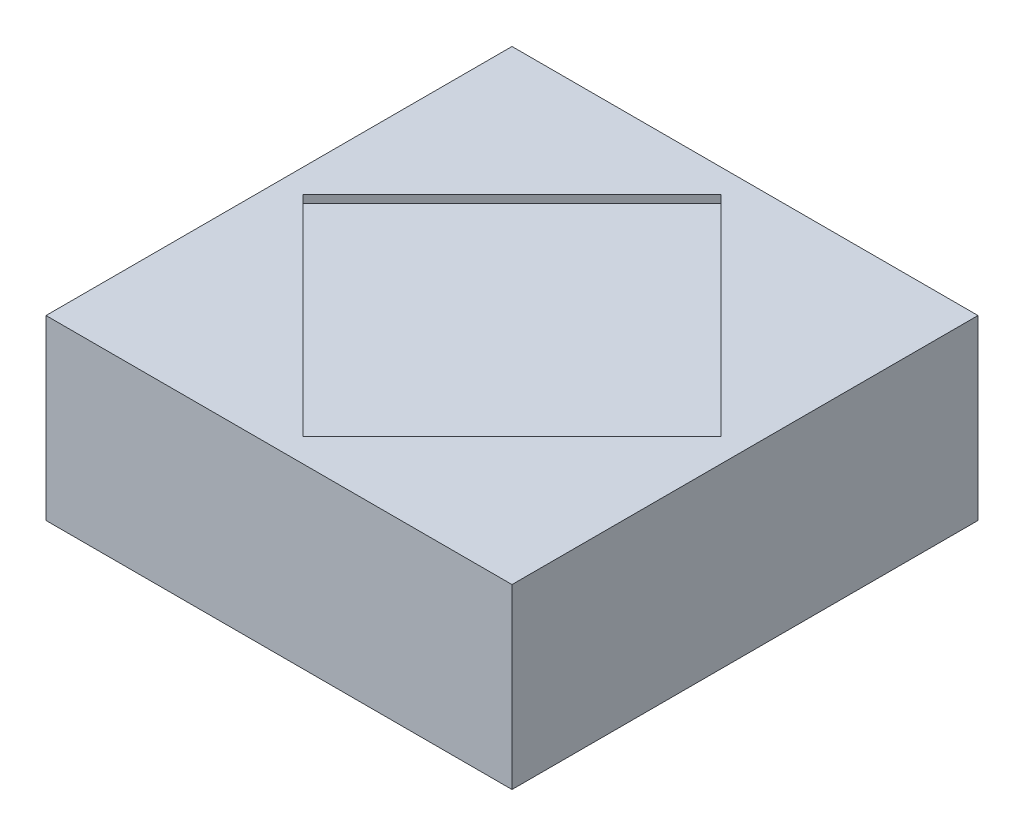
ISO-10303-21;
HEADER;
FILE_DESCRIPTION(('STEP AP214'),'2;1');
FILE_NAME('part.step','',(''),(''),'','','');
FILE_SCHEMA(('AUTOMOTIVE_DESIGN { 1 0 10303 214 1 1 1 1 }'));
ENDSEC;
DATA;
#1=APPLICATION_CONTEXT('core data for automotive mechanical design processes');
#2=APPLICATION_PROTOCOL_DEFINITION('international standard','automotive_design',2000,#1);
#3=PRODUCT_CONTEXT('',#1,'mechanical');
#4=PRODUCT('Part','Part','',(#3));
#5=PRODUCT_RELATED_PRODUCT_CATEGORY('part','',(#4));
#6=PRODUCT_DEFINITION_FORMATION('','',#4);
#7=PRODUCT_DEFINITION_CONTEXT('part definition',#1,'design');
#8=PRODUCT_DEFINITION('design','',#6,#7);
#9=PRODUCT_DEFINITION_SHAPE('','',#8);
#10=(LENGTH_UNIT() NAMED_UNIT(*) SI_UNIT(.MILLI.,.METRE.));
#11=(NAMED_UNIT(*) PLANE_ANGLE_UNIT() SI_UNIT($,.RADIAN.));
#12=(NAMED_UNIT(*) SI_UNIT($,.STERADIAN.) SOLID_ANGLE_UNIT());
#13=UNCERTAINTY_MEASURE_WITH_UNIT(LENGTH_MEASURE(1.E-05),#10,'distance_accuracy_value','');
#14=(GEOMETRIC_REPRESENTATION_CONTEXT(3) GLOBAL_UNCERTAINTY_ASSIGNED_CONTEXT((#13)) GLOBAL_UNIT_ASSIGNED_CONTEXT((#10,
#11,#12)) REPRESENTATION_CONTEXT('',''));
#15=CARTESIAN_POINT('',(0.,0.,0.));
#16=DIRECTION('',(0.,0.,1.));
#17=DIRECTION('',(1.,0.,0.));
#18=AXIS2_PLACEMENT_3D('',#15,#16,#17);
#19=CARTESIAN_POINT('',(0.,12.,0.));
#20=DIRECTION('',(1.,0.,0.));
#21=DIRECTION('',(0.,0.,-1.));
#22=AXIS2_PLACEMENT_3D('',#19,#20,#21);
#23=PLANE('',#22);
#24=DIRECTION('',(0.,0.,1.));
#25=VECTOR('',#24,1.);
#26=CARTESIAN_POINT('',(0.,0.,0.));
#27=LINE('',#26,#25);
#28=CARTESIAN_POINT('',(0.,0.,-31.5));
#29=VERTEX_POINT('',#28);
#30=CARTESIAN_POINT('',(0.,0.,0.));
#31=VERTEX_POINT('',#30);
#32=EDGE_CURVE('E143',#29,#31,#27,.T.);
#33=ORIENTED_EDGE('',*,*,#32,.T.);
#34=DIRECTION('',(0.,-1.,0.));
#35=VECTOR('',#34,1.);
#36=CARTESIAN_POINT('',(0.,12.,0.));
#37=LINE('',#36,#35);
#38=CARTESIAN_POINT('',(0.,12.,0.));
#39=VERTEX_POINT('',#38);
#40=EDGE_CURVE('E11',#39,#31,#37,.T.);
#41=ORIENTED_EDGE('',*,*,#40,.F.);
#42=DIRECTION('',(0.,0.,1.));
#43=VECTOR('',#42,1.);
#44=CARTESIAN_POINT('',(0.,12.,0.));
#45=LINE('',#44,#43);
#46=CARTESIAN_POINT('',(0.,12.,-31.5));
#47=VERTEX_POINT('',#46);
#48=EDGE_CURVE('E147',#47,#39,#45,.T.);
#49=ORIENTED_EDGE('',*,*,#48,.F.);
#50=DIRECTION('',(0.,-1.,0.));
#51=VECTOR('',#50,1.);
#52=CARTESIAN_POINT('',(0.,12.,-31.5));
#53=LINE('',#52,#51);
#54=EDGE_CURVE('E153',#47,#29,#53,.T.);
#55=ORIENTED_EDGE('',*,*,#54,.T.);
#56=EDGE_LOOP('',(#33,#41,#49,#55));
#57=FACE_BOUND('',#56,.T.);
#58=ADVANCED_FACE('F35',(#57),#23,.F.);
#59=CARTESIAN_POINT('',(0.,12.,0.));
#60=DIRECTION('',(0.,0.,-1.));
#61=DIRECTION('',(-1.,0.,0.));
#62=AXIS2_PLACEMENT_3D('',#59,#60,#61);
#63=PLANE('',#62);
#64=DIRECTION('',(1.,0.,0.));
#65=VECTOR('',#64,1.);
#66=CARTESIAN_POINT('',(0.,0.,0.));
#67=LINE('',#66,#65);
#68=CARTESIAN_POINT('',(31.5,0.,0.));
#69=VERTEX_POINT('',#68);
#70=EDGE_CURVE('E156',#31,#69,#67,.T.);
#71=ORIENTED_EDGE('',*,*,#70,.T.);
#72=DIRECTION('',(0.,-1.,0.));
#73=VECTOR('',#72,1.);
#74=CARTESIAN_POINT('',(31.5,12.,0.));
#75=LINE('',#74,#73);
#76=CARTESIAN_POINT('',(31.5,12.,0.));
#77=VERTEX_POINT('',#76);
#78=EDGE_CURVE('E42',#77,#69,#75,.T.);
#79=ORIENTED_EDGE('',*,*,#78,.F.);
#80=DIRECTION('',(1.,0.,0.));
#81=VECTOR('',#80,1.);
#82=CARTESIAN_POINT('',(0.,12.,0.));
#83=LINE('',#82,#81);
#84=EDGE_CURVE('E86',#39,#77,#83,.T.);
#85=ORIENTED_EDGE('',*,*,#84,.F.);
#86=ORIENTED_EDGE('',*,*,#40,.T.);
#87=EDGE_LOOP('',(#71,#79,#85,#86));
#88=FACE_BOUND('',#87,.T.);
#89=ADVANCED_FACE('F185',(#88),#63,.F.);
#90=CARTESIAN_POINT('',(31.5,12.,0.));
#91=DIRECTION('',(-1.,0.,0.));
#92=DIRECTION('',(0.,0.,1.));
#93=AXIS2_PLACEMENT_3D('',#90,#91,#92);
#94=PLANE('',#93);
#95=DIRECTION('',(0.,0.,-1.));
#96=VECTOR('',#95,1.);
#97=CARTESIAN_POINT('',(31.5,0.,0.));
#98=LINE('',#97,#96);
#99=CARTESIAN_POINT('',(31.5,0.,-31.5));
#100=VERTEX_POINT('',#99);
#101=EDGE_CURVE('E158',#69,#100,#98,.T.);
#102=ORIENTED_EDGE('',*,*,#101,.T.);
#103=DIRECTION('',(0.,-1.,0.));
#104=VECTOR('',#103,1.);
#105=CARTESIAN_POINT('',(31.5,12.,-31.5));
#106=LINE('',#105,#104);
#107=CARTESIAN_POINT('',(31.5,12.,-31.5));
#108=VERTEX_POINT('',#107);
#109=EDGE_CURVE('E162',#108,#100,#106,.T.);
#110=ORIENTED_EDGE('',*,*,#109,.F.);
#111=DIRECTION('',(0.,0.,-1.));
#112=VECTOR('',#111,1.);
#113=CARTESIAN_POINT('',(31.5,12.,0.));
#114=LINE('',#113,#112);
#115=EDGE_CURVE('E150',#77,#108,#114,.T.);
#116=ORIENTED_EDGE('',*,*,#115,.F.);
#117=ORIENTED_EDGE('',*,*,#78,.T.);
#118=EDGE_LOOP('',(#102,#110,#116,#117));
#119=FACE_BOUND('',#118,.T.);
#120=ADVANCED_FACE('F167',(#119),#94,.F.);
#121=CARTESIAN_POINT('',(0.,12.,-31.5));
#122=DIRECTION('',(0.,0.,1.));
#123=DIRECTION('',(1.,0.,0.));
#124=AXIS2_PLACEMENT_3D('',#121,#122,#123);
#125=PLANE('',#124);
#126=DIRECTION('',(-1.,0.,0.));
#127=VECTOR('',#126,1.);
#128=CARTESIAN_POINT('',(0.,0.,-31.5));
#129=LINE('',#128,#127);
#130=EDGE_CURVE('E79',#100,#29,#129,.T.);
#131=ORIENTED_EDGE('',*,*,#130,.T.);
#132=ORIENTED_EDGE('',*,*,#54,.F.);
#133=DIRECTION('',(-1.,0.,0.));
#134=VECTOR('',#133,1.);
#135=CARTESIAN_POINT('',(0.,12.,-31.5));
#136=LINE('',#135,#134);
#137=EDGE_CURVE('E58',#108,#47,#136,.T.);
#138=ORIENTED_EDGE('',*,*,#137,.F.);
#139=ORIENTED_EDGE('',*,*,#109,.T.);
#140=EDGE_LOOP('',(#131,#132,#138,#139));
#141=FACE_BOUND('',#140,.T.);
#142=ADVANCED_FACE('F175',(#141),#125,.F.);
#143=CARTESIAN_POINT('',(0.,12.,0.));
#144=DIRECTION('',(0.,-1.,0.));
#145=DIRECTION('',(0.,0.,-1.));
#146=AXIS2_PLACEMENT_3D('',#143,#144,#145);
#147=PLANE('',#146);
#148=DIRECTION('',(0.707106781186548,0.,0.707106781186548));
#149=VECTOR('',#148,1.);
#150=CARTESIAN_POINT('',(1.60786437626905,12.,-15.75));
#151=LINE('',#150,#149);
#152=CARTESIAN_POINT('',(1.60786437626905,12.,-15.75));
#153=VERTEX_POINT('',#152);
#154=CARTESIAN_POINT('',(15.75,12.,-1.60786437626905));
#155=VERTEX_POINT('',#154);
#156=EDGE_CURVE('E137',#153,#155,#151,.T.);
#157=ORIENTED_EDGE('',*,*,#156,.F.);
#158=DIRECTION('',(-0.707106781186547,0.,0.707106781186548));
#159=VECTOR('',#158,1.);
#160=CARTESIAN_POINT('',(1.60786437626905,12.,-15.75));
#161=LINE('',#160,#159);
#162=CARTESIAN_POINT('',(15.75,12.,-29.8921356237309));
#163=VERTEX_POINT('',#162);
#164=EDGE_CURVE('E49',#163,#153,#161,.T.);
#165=ORIENTED_EDGE('',*,*,#164,.F.);
#166=DIRECTION('',(-0.707106781186548,0.,-0.707106781186547));
#167=VECTOR('',#166,1.);
#168=CARTESIAN_POINT('',(15.75,12.,-29.8921356237309));
#169=LINE('',#168,#167);
#170=CARTESIAN_POINT('',(29.892135623731,12.,-15.75));
#171=VERTEX_POINT('',#170);
#172=EDGE_CURVE('E128',#171,#163,#169,.T.);
#173=ORIENTED_EDGE('',*,*,#172,.F.);
#174=DIRECTION('',(0.707106781186547,0.,-0.707106781186548));
#175=VECTOR('',#174,1.);
#176=CARTESIAN_POINT('',(15.75,12.,-1.60786437626905));
#177=LINE('',#176,#175);
#178=EDGE_CURVE('E131',#155,#171,#177,.T.);
#179=ORIENTED_EDGE('',*,*,#178,.F.);
#180=EDGE_LOOP('',(#157,#165,#173,#179));
#181=FACE_BOUND('',#180,.T.);
#182=ORIENTED_EDGE('',*,*,#48,.T.);
#183=ORIENTED_EDGE('',*,*,#84,.T.);
#184=ORIENTED_EDGE('',*,*,#115,.T.);
#185=ORIENTED_EDGE('',*,*,#137,.T.);
#186=EDGE_LOOP('',(#182,#183,#184,#185));
#187=FACE_BOUND('',#186,.T.);
#188=ADVANCED_FACE('F177',(#181,#187),#147,.F.);
#189=CARTESIAN_POINT('',(0.,0.,0.));
#190=DIRECTION('',(0.,-1.,0.));
#191=DIRECTION('',(0.,0.,-1.));
#192=AXIS2_PLACEMENT_3D('',#189,#190,#191);
#193=PLANE('',#192);
#194=ORIENTED_EDGE('',*,*,#32,.F.);
#195=ORIENTED_EDGE('',*,*,#130,.F.);
#196=ORIENTED_EDGE('',*,*,#101,.F.);
#197=ORIENTED_EDGE('',*,*,#70,.F.);
#198=EDGE_LOOP('',(#194,#195,#196,#197));
#199=FACE_BOUND('',#198,.T.);
#200=ADVANCED_FACE('F171',(#199),#193,.T.);
#201=CARTESIAN_POINT('',(1.60786437626905,11.5,-15.75));
#202=DIRECTION('',(-0.707106781186548,0.,-0.707106781186547));
#203=DIRECTION('',(-0.707106781186547,0.,0.707106781186548));
#204=AXIS2_PLACEMENT_3D('',#201,#202,#203);
#205=PLANE('',#204);
#206=ORIENTED_EDGE('',*,*,#164,.T.);
#207=DIRECTION('',(0.,1.,0.));
#208=VECTOR('',#207,1.);
#209=CARTESIAN_POINT('',(1.60786437626905,11.5,-15.75));
#210=LINE('',#209,#208);
#211=CARTESIAN_POINT('',(1.60786437626905,11.5,-15.75));
#212=VERTEX_POINT('',#211);
#213=EDGE_CURVE('E106',#212,#153,#210,.T.);
#214=ORIENTED_EDGE('',*,*,#213,.F.);
#215=DIRECTION('',(-0.707106781186547,0.,0.707106781186548));
#216=VECTOR('',#215,1.);
#217=CARTESIAN_POINT('',(1.60786437626905,11.5,-15.75));
#218=LINE('',#217,#216);
#219=CARTESIAN_POINT('',(15.75,11.5,-29.8921356237309));
#220=VERTEX_POINT('',#219);
#221=EDGE_CURVE('E110',#220,#212,#218,.T.);
#222=ORIENTED_EDGE('',*,*,#221,.F.);
#223=DIRECTION('',(0.,1.,0.));
#224=VECTOR('',#223,1.);
#225=CARTESIAN_POINT('',(15.75,11.5,-29.8921356237309));
#226=LINE('',#225,#224);
#227=EDGE_CURVE('E141',#220,#163,#226,.T.);
#228=ORIENTED_EDGE('',*,*,#227,.T.);
#229=EDGE_LOOP('',(#206,#214,#222,#228));
#230=FACE_BOUND('',#229,.T.);
#231=ADVANCED_FACE('F108',(#230),#205,.F.);
#232=CARTESIAN_POINT('',(15.75,11.5,-29.8921356237309));
#233=DIRECTION('',(0.707106781186547,0.,-0.707106781186548));
#234=DIRECTION('',(-0.707106781186548,0.,-0.707106781186547));
#235=AXIS2_PLACEMENT_3D('',#232,#233,#234);
#236=PLANE('',#235);
#237=ORIENTED_EDGE('',*,*,#172,.T.);
#238=ORIENTED_EDGE('',*,*,#227,.F.);
#239=DIRECTION('',(-0.707106781186548,0.,-0.707106781186547));
#240=VECTOR('',#239,1.);
#241=CARTESIAN_POINT('',(15.75,11.5,-29.8921356237309));
#242=LINE('',#241,#240);
#243=CARTESIAN_POINT('',(29.892135623731,11.5,-15.75));
#244=VERTEX_POINT('',#243);
#245=EDGE_CURVE('E116',#244,#220,#242,.T.);
#246=ORIENTED_EDGE('',*,*,#245,.F.);
#247=DIRECTION('',(0.,1.,0.));
#248=VECTOR('',#247,1.);
#249=CARTESIAN_POINT('',(29.892135623731,11.5,-15.75));
#250=LINE('',#249,#248);
#251=EDGE_CURVE('E144',#244,#171,#250,.T.);
#252=ORIENTED_EDGE('',*,*,#251,.T.);
#253=EDGE_LOOP('',(#237,#238,#246,#252));
#254=FACE_BOUND('',#253,.T.);
#255=ADVANCED_FACE('F224',(#254),#236,.F.);
#256=CARTESIAN_POINT('',(15.75,11.5,-1.60786437626905));
#257=DIRECTION('',(0.707106781186548,0.,0.707106781186547));
#258=DIRECTION('',(0.707106781186547,0.,-0.707106781186548));
#259=AXIS2_PLACEMENT_3D('',#256,#257,#258);
#260=PLANE('',#259);
#261=ORIENTED_EDGE('',*,*,#178,.T.);
#262=ORIENTED_EDGE('',*,*,#251,.F.);
#263=DIRECTION('',(0.707106781186547,0.,-0.707106781186548));
#264=VECTOR('',#263,1.);
#265=CARTESIAN_POINT('',(15.75,11.5,-1.60786437626905));
#266=LINE('',#265,#264);
#267=CARTESIAN_POINT('',(15.75,11.5,-1.60786437626905));
#268=VERTEX_POINT('',#267);
#269=EDGE_CURVE('E124',#268,#244,#266,.T.);
#270=ORIENTED_EDGE('',*,*,#269,.F.);
#271=DIRECTION('',(0.,1.,0.));
#272=VECTOR('',#271,1.);
#273=CARTESIAN_POINT('',(15.75,11.5,-1.60786437626905));
#274=LINE('',#273,#272);
#275=EDGE_CURVE('E115',#268,#155,#274,.T.);
#276=ORIENTED_EDGE('',*,*,#275,.T.);
#277=EDGE_LOOP('',(#261,#262,#270,#276));
#278=FACE_BOUND('',#277,.T.);
#279=ADVANCED_FACE('F233',(#278),#260,.F.);
#280=CARTESIAN_POINT('',(1.60786437626905,11.5,-15.75));
#281=DIRECTION('',(-0.707106781186547,0.,0.707106781186548));
#282=DIRECTION('',(0.707106781186548,0.,0.707106781186547));
#283=AXIS2_PLACEMENT_3D('',#280,#281,#282);
#284=PLANE('',#283);
#285=ORIENTED_EDGE('',*,*,#156,.T.);
#286=ORIENTED_EDGE('',*,*,#275,.F.);
#287=DIRECTION('',(0.707106781186548,0.,0.707106781186548));
#288=VECTOR('',#287,1.);
#289=CARTESIAN_POINT('',(1.60786437626905,11.5,-15.75));
#290=LINE('',#289,#288);
#291=EDGE_CURVE('E119',#212,#268,#290,.T.);
#292=ORIENTED_EDGE('',*,*,#291,.F.);
#293=ORIENTED_EDGE('',*,*,#213,.T.);
#294=EDGE_LOOP('',(#285,#286,#292,#293));
#295=FACE_BOUND('',#294,.T.);
#296=ADVANCED_FACE('F120',(#295),#284,.F.);
#297=CARTESIAN_POINT('',(0.,11.5,0.));
#298=DIRECTION('',(0.,-1.,0.));
#299=DIRECTION('',(0.,0.,-1.));
#300=AXIS2_PLACEMENT_3D('',#297,#298,#299);
#301=PLANE('',#300);
#302=ORIENTED_EDGE('',*,*,#221,.T.);
#303=ORIENTED_EDGE('',*,*,#291,.T.);
#304=ORIENTED_EDGE('',*,*,#269,.T.);
#305=ORIENTED_EDGE('',*,*,#245,.T.);
#306=EDGE_LOOP('',(#302,#303,#304,#305));
#307=FACE_BOUND('',#306,.T.);
#308=ADVANCED_FACE('F126',(#307),#301,.F.);
#309=CLOSED_SHELL('',(#58,#89,#120,#142,#188,#200,#231,#255,#279,#296,#308));
#310=MANIFOLD_SOLID_BREP('B2',#309);
#311=ADVANCED_BREP_SHAPE_REPRESENTATION('',(#18,#310),#14);
#312=SHAPE_DEFINITION_REPRESENTATION(#9,#311);
ENDSEC;
END-ISO-10303-21;
